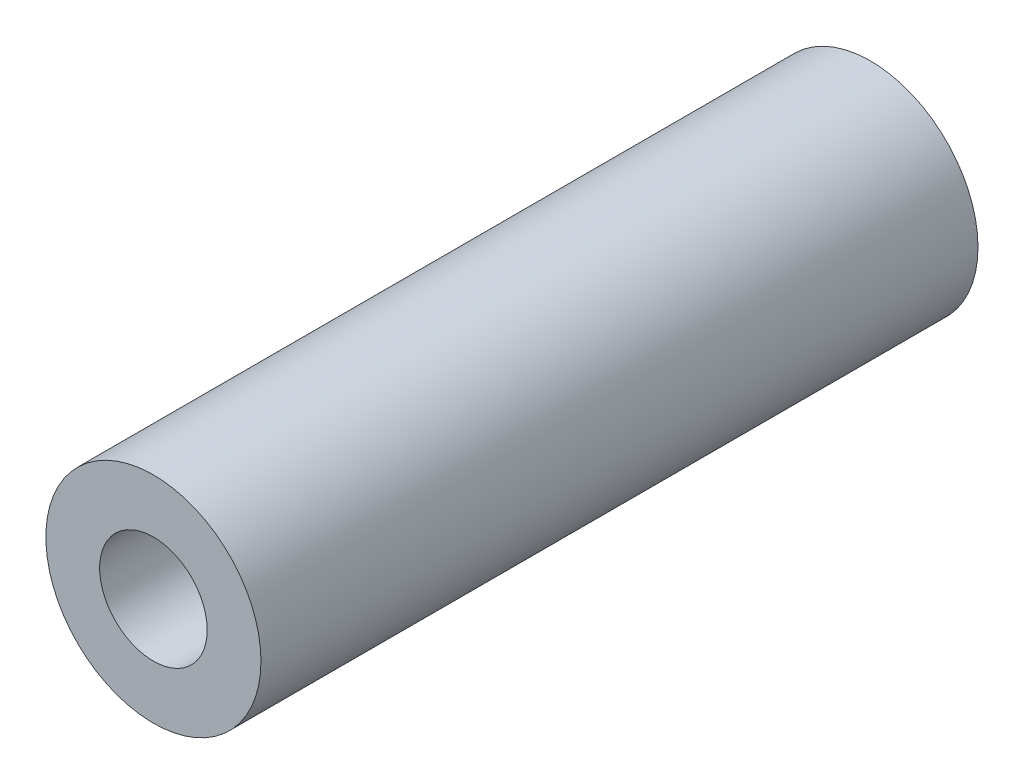
ISO-10303-21;
HEADER;
FILE_DESCRIPTION(('STEP AP214'),'2;1');
FILE_NAME('part.step','',(''),(''),'','','');
FILE_SCHEMA(('AUTOMOTIVE_DESIGN { 1 0 10303 214 1 1 1 1 }'));
ENDSEC;
DATA;
#1=APPLICATION_CONTEXT('core data for automotive mechanical design processes');
#2=APPLICATION_PROTOCOL_DEFINITION('international standard','automotive_design',2000,#1);
#3=PRODUCT_CONTEXT('',#1,'mechanical');
#4=PRODUCT('Part','Part','',(#3));
#5=PRODUCT_RELATED_PRODUCT_CATEGORY('part','',(#4));
#6=PRODUCT_DEFINITION_FORMATION('','',#4);
#7=PRODUCT_DEFINITION_CONTEXT('part definition',#1,'design');
#8=PRODUCT_DEFINITION('design','',#6,#7);
#9=PRODUCT_DEFINITION_SHAPE('','',#8);
#10=(LENGTH_UNIT() NAMED_UNIT(*) SI_UNIT(.MILLI.,.METRE.));
#11=(NAMED_UNIT(*) PLANE_ANGLE_UNIT() SI_UNIT($,.RADIAN.));
#12=(NAMED_UNIT(*) SI_UNIT($,.STERADIAN.) SOLID_ANGLE_UNIT());
#13=UNCERTAINTY_MEASURE_WITH_UNIT(LENGTH_MEASURE(1.E-05),#10,'distance_accuracy_value','');
#14=(GEOMETRIC_REPRESENTATION_CONTEXT(3) GLOBAL_UNCERTAINTY_ASSIGNED_CONTEXT((#13)) GLOBAL_UNIT_ASSIGNED_CONTEXT((#10,
#11,#12)) REPRESENTATION_CONTEXT('',''));
#15=CARTESIAN_POINT('',(0.,0.,0.));
#16=DIRECTION('',(0.,0.,1.));
#17=DIRECTION('',(1.,0.,0.));
#18=AXIS2_PLACEMENT_3D('',#15,#16,#17);
#19=CARTESIAN_POINT('',(0.,0.,60.));
#20=DIRECTION('',(0.,0.,1.));
#21=DIRECTION('',(1.,0.,0.));
#22=AXIS2_PLACEMENT_3D('',#19,#20,#21);
#23=PLANE('',#22);
#24=CARTESIAN_POINT('',(0.,0.,60.));
#25=DIRECTION('',(0.,0.,1.));
#26=DIRECTION('',(1.,0.,0.));
#27=AXIS2_PLACEMENT_3D('',#24,#25,#26);
#28=CIRCLE('',#27,9.);
#29=CARTESIAN_POINT('',(9.,0.,60.));
#30=VERTEX_POINT('',#29);
#31=EDGE_CURVE('E11',#30,#30,#28,.T.);
#32=ORIENTED_EDGE('',*,*,#31,.T.);
#33=EDGE_LOOP('',(#32));
#34=FACE_BOUND('',#33,.T.);
#35=CARTESIAN_POINT('',(0.,0.,60.));
#36=DIRECTION('',(0.,0.,1.));
#37=DIRECTION('',(1.,0.,0.));
#38=AXIS2_PLACEMENT_3D('',#35,#36,#37);
#39=CIRCLE('',#38,4.5);
#40=CARTESIAN_POINT('',(4.5,0.,60.));
#41=VERTEX_POINT('',#40);
#42=EDGE_CURVE('E56',#41,#41,#39,.T.);
#43=ORIENTED_EDGE('',*,*,#42,.F.);
#44=EDGE_LOOP('',(#43));
#45=FACE_BOUND('',#44,.T.);
#46=ADVANCED_FACE('F43',(#34,#45),#23,.T.);
#47=CARTESIAN_POINT('',(0.,0.,0.));
#48=DIRECTION('',(0.,0.,1.));
#49=DIRECTION('',(1.,0.,0.));
#50=AXIS2_PLACEMENT_3D('',#47,#48,#49);
#51=PLANE('',#50);
#52=CARTESIAN_POINT('',(0.,0.,0.));
#53=DIRECTION('',(0.,0.,1.));
#54=DIRECTION('',(1.,0.,0.));
#55=AXIS2_PLACEMENT_3D('',#52,#53,#54);
#56=CIRCLE('',#55,9.);
#57=CARTESIAN_POINT('',(9.,0.,0.));
#58=VERTEX_POINT('',#57);
#59=EDGE_CURVE('E47',#58,#58,#56,.T.);
#60=ORIENTED_EDGE('',*,*,#59,.F.);
#61=EDGE_LOOP('',(#60));
#62=FACE_BOUND('',#61,.T.);
#63=CARTESIAN_POINT('',(0.,0.,0.));
#64=DIRECTION('',(0.,0.,1.));
#65=DIRECTION('',(1.,0.,0.));
#66=AXIS2_PLACEMENT_3D('',#63,#64,#65);
#67=CIRCLE('',#66,4.5);
#68=CARTESIAN_POINT('',(4.5,0.,0.));
#69=VERTEX_POINT('',#68);
#70=EDGE_CURVE('E58',#69,#69,#67,.T.);
#71=ORIENTED_EDGE('',*,*,#70,.T.);
#72=EDGE_LOOP('',(#71));
#73=FACE_BOUND('',#72,.T.);
#74=ADVANCED_FACE('F70',(#62,#73),#51,.F.);
#75=CARTESIAN_POINT('',(0.,0.,60.));
#76=DIRECTION('',(0.,0.,-1.));
#77=DIRECTION('',(-1.,0.,0.));
#78=AXIS2_PLACEMENT_3D('',#75,#76,#77);
#79=CYLINDRICAL_SURFACE('',#78,9.);
#80=ORIENTED_EDGE('',*,*,#31,.F.);
#81=EDGE_LOOP('',(#80));
#82=FACE_BOUND('',#81,.T.);
#83=ORIENTED_EDGE('',*,*,#59,.T.);
#84=EDGE_LOOP('',(#83));
#85=FACE_BOUND('',#84,.T.);
#86=ADVANCED_FACE('F45',(#82,#85),#79,.T.);
#87=CARTESIAN_POINT('',(0.,0.,60.));
#88=DIRECTION('',(0.,0.,-1.));
#89=DIRECTION('',(-1.,0.,0.));
#90=AXIS2_PLACEMENT_3D('',#87,#88,#89);
#91=CYLINDRICAL_SURFACE('',#90,4.5);
#92=ORIENTED_EDGE('',*,*,#42,.T.);
#93=EDGE_LOOP('',(#92));
#94=FACE_BOUND('',#93,.T.);
#95=ORIENTED_EDGE('',*,*,#70,.F.);
#96=EDGE_LOOP('',(#95));
#97=FACE_BOUND('',#96,.T.);
#98=ADVANCED_FACE('F66',(#94,#97),#91,.F.);
#99=CLOSED_SHELL('',(#46,#74,#86,#98));
#100=MANIFOLD_SOLID_BREP('B2',#99);
#101=ADVANCED_BREP_SHAPE_REPRESENTATION('',(#18,#100),#14);
#102=SHAPE_DEFINITION_REPRESENTATION(#9,#101);
ENDSEC;
END-ISO-10303-21;
